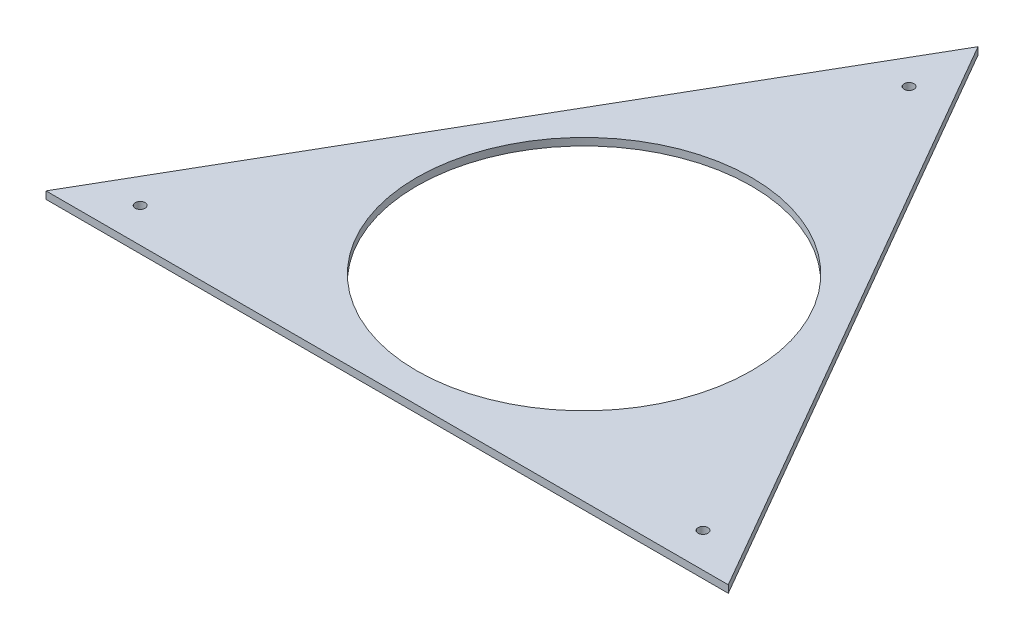
ISO-10303-21;
HEADER;
FILE_DESCRIPTION(('STEP AP214'),'2;1');
FILE_NAME('part.step','',(''),(''),'','','');
FILE_SCHEMA(('AUTOMOTIVE_DESIGN { 1 0 10303 214 1 1 1 1 }'));
ENDSEC;
DATA;
#1=APPLICATION_CONTEXT('core data for automotive mechanical design processes');
#2=APPLICATION_PROTOCOL_DEFINITION('international standard','automotive_design',2000,#1);
#3=PRODUCT_CONTEXT('',#1,'mechanical');
#4=PRODUCT('Part','Part','',(#3));
#5=PRODUCT_RELATED_PRODUCT_CATEGORY('part','',(#4));
#6=PRODUCT_DEFINITION_FORMATION('','',#4);
#7=PRODUCT_DEFINITION_CONTEXT('part definition',#1,'design');
#8=PRODUCT_DEFINITION('design','',#6,#7);
#9=PRODUCT_DEFINITION_SHAPE('','',#8);
#10=(LENGTH_UNIT() NAMED_UNIT(*) SI_UNIT(.MILLI.,.METRE.));
#11=(NAMED_UNIT(*) PLANE_ANGLE_UNIT() SI_UNIT($,.RADIAN.));
#12=(NAMED_UNIT(*) SI_UNIT($,.STERADIAN.) SOLID_ANGLE_UNIT());
#13=UNCERTAINTY_MEASURE_WITH_UNIT(LENGTH_MEASURE(1.E-05),#10,'distance_accuracy_value','');
#14=(GEOMETRIC_REPRESENTATION_CONTEXT(3) GLOBAL_UNCERTAINTY_ASSIGNED_CONTEXT((#13)) GLOBAL_UNIT_ASSIGNED_CONTEXT((#10,
#11,#12)) REPRESENTATION_CONTEXT('',''));
#15=CARTESIAN_POINT('',(0.,0.,0.));
#16=DIRECTION('',(0.,0.,1.));
#17=DIRECTION('',(1.,0.,0.));
#18=AXIS2_PLACEMENT_3D('',#15,#16,#17);
#19=CARTESIAN_POINT('',(219.970452561248,4.7625,127.));
#20=DIRECTION('',(-0.866025403784438,0.,0.500000000000001));
#21=DIRECTION('',(0.500000000000001,0.,0.866025403784438));
#22=AXIS2_PLACEMENT_3D('',#19,#20,#21);
#23=PLANE('',#22);
#24=DIRECTION('',(-0.500000000000001,0.,-0.866025403784438));
#25=VECTOR('',#24,1.);
#26=CARTESIAN_POINT('',(219.970452561248,0.,127.));
#27=LINE('',#26,#25);
#28=CARTESIAN_POINT('',(219.970452561248,0.,127.));
#29=VERTEX_POINT('',#28);
#30=CARTESIAN_POINT('',(0.,0.,-254.));
#31=VERTEX_POINT('',#30);
#32=EDGE_CURVE('E84',#29,#31,#27,.T.);
#33=ORIENTED_EDGE('',*,*,#32,.T.);
#34=DIRECTION('',(0.,-1.,0.));
#35=VECTOR('',#34,1.);
#36=CARTESIAN_POINT('',(0.,4.7625,-254.));
#37=LINE('',#36,#35);
#38=CARTESIAN_POINT('',(0.,4.7625,-254.));
#39=VERTEX_POINT('',#38);
#40=EDGE_CURVE('E11',#39,#31,#37,.T.);
#41=ORIENTED_EDGE('',*,*,#40,.F.);
#42=DIRECTION('',(-0.500000000000001,0.,-0.866025403784438));
#43=VECTOR('',#42,1.);
#44=CARTESIAN_POINT('',(219.970452561248,4.7625,127.));
#45=LINE('',#44,#43);
#46=CARTESIAN_POINT('',(219.970452561248,4.7625,127.));
#47=VERTEX_POINT('',#46);
#48=EDGE_CURVE('E77',#47,#39,#45,.T.);
#49=ORIENTED_EDGE('',*,*,#48,.F.);
#50=DIRECTION('',(0.,-1.,0.));
#51=VECTOR('',#50,1.);
#52=CARTESIAN_POINT('',(219.970452561248,4.7625,127.));
#53=LINE('',#52,#51);
#54=EDGE_CURVE('E85',#47,#29,#53,.T.);
#55=ORIENTED_EDGE('',*,*,#54,.T.);
#56=EDGE_LOOP('',(#33,#41,#49,#55));
#57=FACE_BOUND('',#56,.T.);
#58=ADVANCED_FACE('F36',(#57),#23,.F.);
#59=CARTESIAN_POINT('',(0.,4.7625,-254.));
#60=DIRECTION('',(0.866025403784439,0.,0.5));
#61=DIRECTION('',(0.5,0.,-0.866025403784439));
#62=AXIS2_PLACEMENT_3D('',#59,#60,#61);
#63=PLANE('',#62);
#64=DIRECTION('',(-0.5,0.,0.866025403784438));
#65=VECTOR('',#64,1.);
#66=CARTESIAN_POINT('',(0.,0.,-254.));
#67=LINE('',#66,#65);
#68=CARTESIAN_POINT('',(-219.970452561247,0.,127.));
#69=VERTEX_POINT('',#68);
#70=EDGE_CURVE('E65',#31,#69,#67,.T.);
#71=ORIENTED_EDGE('',*,*,#70,.T.);
#72=DIRECTION('',(0.,-1.,0.));
#73=VECTOR('',#72,1.);
#74=CARTESIAN_POINT('',(-219.970452561247,4.7625,127.));
#75=LINE('',#74,#73);
#76=CARTESIAN_POINT('',(-219.970452561247,4.7625,127.));
#77=VERTEX_POINT('',#76);
#78=EDGE_CURVE('E45',#77,#69,#75,.T.);
#79=ORIENTED_EDGE('',*,*,#78,.F.);
#80=DIRECTION('',(-0.5,0.,0.866025403784438));
#81=VECTOR('',#80,1.);
#82=CARTESIAN_POINT('',(0.,4.7625,-254.));
#83=LINE('',#82,#81);
#84=EDGE_CURVE('E73',#39,#77,#83,.T.);
#85=ORIENTED_EDGE('',*,*,#84,.F.);
#86=ORIENTED_EDGE('',*,*,#40,.T.);
#87=EDGE_LOOP('',(#71,#79,#85,#86));
#88=FACE_BOUND('',#87,.T.);
#89=ADVANCED_FACE('F74',(#88),#63,.F.);
#90=CARTESIAN_POINT('',(-219.970452561247,4.7625,127.));
#91=DIRECTION('',(0.,0.,-1.));
#92=DIRECTION('',(-1.,0.,0.));
#93=AXIS2_PLACEMENT_3D('',#90,#91,#92);
#94=PLANE('',#93);
#95=DIRECTION('',(1.,0.,0.));
#96=VECTOR('',#95,1.);
#97=CARTESIAN_POINT('',(-219.970452561247,0.,127.));
#98=LINE('',#97,#96);
#99=EDGE_CURVE('E70',#69,#29,#98,.T.);
#100=ORIENTED_EDGE('',*,*,#99,.T.);
#101=ORIENTED_EDGE('',*,*,#54,.F.);
#102=DIRECTION('',(1.,0.,0.));
#103=VECTOR('',#102,1.);
#104=CARTESIAN_POINT('',(-219.970452561247,4.7625,127.));
#105=LINE('',#104,#103);
#106=EDGE_CURVE('E53',#77,#47,#105,.T.);
#107=ORIENTED_EDGE('',*,*,#106,.F.);
#108=ORIENTED_EDGE('',*,*,#78,.T.);
#109=EDGE_LOOP('',(#100,#101,#107,#108));
#110=FACE_BOUND('',#109,.T.);
#111=ADVANCED_FACE('F95',(#110),#94,.F.);
#112=CARTESIAN_POINT('',(0.,4.7625,0.));
#113=DIRECTION('',(0.,1.,0.));
#114=DIRECTION('',(0.,0.,1.));
#115=AXIS2_PLACEMENT_3D('',#112,#113,#114);
#116=PLANE('',#115);
#117=CARTESIAN_POINT('',(181.475623363029,4.7625,104.775));
#118=DIRECTION('',(0.,-1.,0.));
#119=DIRECTION('',(0.,0.,1.));
#120=AXIS2_PLACEMENT_3D('',#117,#118,#119);
#121=CIRCLE('',#120,3.175);
#122=CARTESIAN_POINT('',(181.475623363029,4.7625,101.6));
#123=VERTEX_POINT('',#122);
#124=EDGE_CURVE('E191',#123,#123,#121,.T.);
#125=ORIENTED_EDGE('',*,*,#124,.T.);
#126=EDGE_LOOP('',(#125));
#127=FACE_BOUND('',#126,.T.);
#128=CARTESIAN_POINT('',(-181.475623363029,4.7625,104.775));
#129=DIRECTION('',(0.,1.,0.));
#130=DIRECTION('',(0.,0.,1.));
#131=AXIS2_PLACEMENT_3D('',#128,#129,#130);
#132=CIRCLE('',#131,3.175);
#133=CARTESIAN_POINT('',(-181.475623363029,4.7625,101.6));
#134=VERTEX_POINT('',#133);
#135=EDGE_CURVE('E201',#134,#134,#132,.T.);
#136=ORIENTED_EDGE('',*,*,#135,.F.);
#137=EDGE_LOOP('',(#136));
#138=FACE_BOUND('',#137,.T.);
#139=CARTESIAN_POINT('',(0.,4.7625,-209.55));
#140=DIRECTION('',(0.,1.,0.));
#141=DIRECTION('',(0.,0.,1.));
#142=AXIS2_PLACEMENT_3D('',#139,#140,#141);
#143=CIRCLE('',#142,3.175);
#144=CARTESIAN_POINT('',(0.,4.7625,-212.725));
#145=VERTEX_POINT('',#144);
#146=EDGE_CURVE('E186',#145,#145,#143,.T.);
#147=ORIENTED_EDGE('',*,*,#146,.F.);
#148=EDGE_LOOP('',(#147));
#149=FACE_BOUND('',#148,.T.);
#150=CARTESIAN_POINT('',(0.,4.7625,0.));
#151=DIRECTION('',(0.,1.,0.));
#152=DIRECTION('',(0.,0.,1.));
#153=AXIS2_PLACEMENT_3D('',#150,#151,#152);
#154=CIRCLE('',#153,107.95);
#155=CARTESIAN_POINT('',(0.,4.7625,-107.95));
#156=VERTEX_POINT('',#155);
#157=EDGE_CURVE('E90',#156,#156,#154,.T.);
#158=ORIENTED_EDGE('',*,*,#157,.F.);
#159=EDGE_LOOP('',(#158));
#160=FACE_BOUND('',#159,.T.);
#161=ORIENTED_EDGE('',*,*,#48,.T.);
#162=ORIENTED_EDGE('',*,*,#84,.T.);
#163=ORIENTED_EDGE('',*,*,#106,.T.);
#164=EDGE_LOOP('',(#161,#162,#163));
#165=FACE_BOUND('',#164,.T.);
#166=ADVANCED_FACE('F80',(#127,#138,#149,#160,#165),#116,.T.);
#167=CARTESIAN_POINT('',(0.,0.,0.));
#168=DIRECTION('',(0.,1.,0.));
#169=DIRECTION('',(0.,0.,1.));
#170=AXIS2_PLACEMENT_3D('',#167,#168,#169);
#171=PLANE('',#170);
#172=CARTESIAN_POINT('',(181.475623363029,0.,104.775));
#173=DIRECTION('',(0.,-1.,0.));
#174=DIRECTION('',(0.,0.,1.));
#175=AXIS2_PLACEMENT_3D('',#172,#173,#174);
#176=CIRCLE('',#175,3.175);
#177=CARTESIAN_POINT('',(181.475623363029,0.,101.6));
#178=VERTEX_POINT('',#177);
#179=EDGE_CURVE('E196',#178,#178,#176,.T.);
#180=ORIENTED_EDGE('',*,*,#179,.F.);
#181=EDGE_LOOP('',(#180));
#182=FACE_BOUND('',#181,.T.);
#183=CARTESIAN_POINT('',(-181.475623363029,0.,104.775));
#184=DIRECTION('',(0.,1.,0.));
#185=DIRECTION('',(0.,0.,1.));
#186=AXIS2_PLACEMENT_3D('',#183,#184,#185);
#187=CIRCLE('',#186,3.175);
#188=CARTESIAN_POINT('',(-181.475623363029,0.,101.6));
#189=VERTEX_POINT('',#188);
#190=EDGE_CURVE('E193',#189,#189,#187,.T.);
#191=ORIENTED_EDGE('',*,*,#190,.T.);
#192=EDGE_LOOP('',(#191));
#193=FACE_BOUND('',#192,.T.);
#194=CARTESIAN_POINT('',(0.,0.,-209.55));
#195=DIRECTION('',(0.,1.,0.));
#196=DIRECTION('',(0.,0.,1.));
#197=AXIS2_PLACEMENT_3D('',#194,#195,#196);
#198=CIRCLE('',#197,3.175);
#199=CARTESIAN_POINT('',(0.,0.,-212.725));
#200=VERTEX_POINT('',#199);
#201=EDGE_CURVE('E189',#200,#200,#198,.T.);
#202=ORIENTED_EDGE('',*,*,#201,.T.);
#203=EDGE_LOOP('',(#202));
#204=FACE_BOUND('',#203,.T.);
#205=CARTESIAN_POINT('',(0.,0.,0.));
#206=DIRECTION('',(0.,1.,0.));
#207=DIRECTION('',(0.,0.,1.));
#208=AXIS2_PLACEMENT_3D('',#205,#206,#207);
#209=CIRCLE('',#208,107.95);
#210=CARTESIAN_POINT('',(0.,0.,-107.95));
#211=VERTEX_POINT('',#210);
#212=EDGE_CURVE('E39',#211,#211,#209,.F.);
#213=ORIENTED_EDGE('',*,*,#212,.F.);
#214=EDGE_LOOP('',(#213));
#215=FACE_BOUND('',#214,.T.);
#216=ORIENTED_EDGE('',*,*,#32,.F.);
#217=ORIENTED_EDGE('',*,*,#99,.F.);
#218=ORIENTED_EDGE('',*,*,#70,.F.);
#219=EDGE_LOOP('',(#216,#217,#218));
#220=FACE_BOUND('',#219,.T.);
#221=ADVANCED_FACE('F96',(#182,#193,#204,#215,#220),#171,.F.);
#222=CARTESIAN_POINT('',(0.,4.7625,0.));
#223=DIRECTION('',(0.,-1.,0.));
#224=DIRECTION('',(0.,0.,-1.));
#225=AXIS2_PLACEMENT_3D('',#222,#223,#224);
#226=CYLINDRICAL_SURFACE('',#225,107.95);
#227=CARTESIAN_POINT('',(0.,4.7625,-107.95));
#228=CARTESIAN_POINT('',(0.,4.712890625,-107.95));
#229=CARTESIAN_POINT('',(0.,4.66328125,-107.95));
#230=CARTESIAN_POINT('',(0.,4.5640625,-107.95));
#231=CARTESIAN_POINT('',(0.,4.514453125,-107.95));
#232=CARTESIAN_POINT('',(0.,4.415234375,-107.95));
#233=CARTESIAN_POINT('',(0.,4.365625,-107.95));
#234=CARTESIAN_POINT('',(0.,4.26640625,-107.95));
#235=CARTESIAN_POINT('',(0.,4.216796875,-107.95));
#236=CARTESIAN_POINT('',(0.,4.117578125,-107.95));
#237=CARTESIAN_POINT('',(0.,4.06796875,-107.95));
#238=CARTESIAN_POINT('',(0.,3.96875,-107.95));
#239=CARTESIAN_POINT('',(0.,3.919140625,-107.95));
#240=CARTESIAN_POINT('',(0.,3.819921875,-107.95));
#241=CARTESIAN_POINT('',(0.,3.7703125,-107.95));
#242=CARTESIAN_POINT('',(0.,3.67109375,-107.95));
#243=CARTESIAN_POINT('',(0.,3.621484375,-107.95));
#244=CARTESIAN_POINT('',(0.,3.522265625,-107.95));
#245=CARTESIAN_POINT('',(0.,3.47265625,-107.95));
#246=CARTESIAN_POINT('',(0.,3.3734375,-107.95));
#247=CARTESIAN_POINT('',(0.,3.323828125,-107.95));
#248=CARTESIAN_POINT('',(0.,3.224609375,-107.95));
#249=CARTESIAN_POINT('',(0.,3.175,-107.95));
#250=CARTESIAN_POINT('',(0.,3.07578125,-107.95));
#251=CARTESIAN_POINT('',(0.,3.026171875,-107.95));
#252=CARTESIAN_POINT('',(0.,2.926953125,-107.95));
#253=CARTESIAN_POINT('',(0.,2.87734375,-107.95));
#254=CARTESIAN_POINT('',(0.,2.778125,-107.95));
#255=CARTESIAN_POINT('',(0.,2.728515625,-107.95));
#256=CARTESIAN_POINT('',(0.,2.629296875,-107.95));
#257=CARTESIAN_POINT('',(0.,2.5796875,-107.95));
#258=CARTESIAN_POINT('',(0.,2.48046875,-107.95));
#259=CARTESIAN_POINT('',(0.,2.430859375,-107.95));
#260=CARTESIAN_POINT('',(0.,2.331640625,-107.95));
#261=CARTESIAN_POINT('',(0.,2.28203125,-107.95));
#262=CARTESIAN_POINT('',(0.,2.1828125,-107.95));
#263=CARTESIAN_POINT('',(0.,2.133203125,-107.95));
#264=CARTESIAN_POINT('',(0.,2.033984375,-107.95));
#265=CARTESIAN_POINT('',(0.,1.984375,-107.95));
#266=CARTESIAN_POINT('',(0.,1.88515625,-107.95));
#267=CARTESIAN_POINT('',(0.,1.835546875,-107.95));
#268=CARTESIAN_POINT('',(0.,1.736328125,-107.95));
#269=CARTESIAN_POINT('',(0.,1.68671875,-107.95));
#270=CARTESIAN_POINT('',(0.,1.5875,-107.95));
#271=CARTESIAN_POINT('',(0.,1.537890625,-107.95));
#272=CARTESIAN_POINT('',(0.,1.438671875,-107.95));
#273=CARTESIAN_POINT('',(0.,1.3890625,-107.95));
#274=CARTESIAN_POINT('',(0.,1.28984375,-107.95));
#275=CARTESIAN_POINT('',(0.,1.240234375,-107.95));
#276=CARTESIAN_POINT('',(0.,1.141015625,-107.95));
#277=CARTESIAN_POINT('',(0.,1.09140625,-107.95));
#278=CARTESIAN_POINT('',(0.,0.992187499999999,-107.95));
#279=CARTESIAN_POINT('',(0.,0.942578124999999,-107.95));
#280=CARTESIAN_POINT('',(0.,0.843359375,-107.95));
#281=CARTESIAN_POINT('',(0.,0.79375,-107.95));
#282=CARTESIAN_POINT('',(0.,0.69453125,-107.95));
#283=CARTESIAN_POINT('',(0.,0.644921875,-107.95));
#284=CARTESIAN_POINT('',(0.,0.545703125,-107.95));
#285=CARTESIAN_POINT('',(0.,0.49609375,-107.95));
#286=CARTESIAN_POINT('',(0.,0.396875,-107.95));
#287=CARTESIAN_POINT('',(0.,0.347265625,-107.95));
#288=CARTESIAN_POINT('',(0.,0.248046875,-107.95));
#289=CARTESIAN_POINT('',(0.,0.1984375,-107.95));
#290=CARTESIAN_POINT('',(0.,0.09921875,-107.95));
#291=CARTESIAN_POINT('',(0.,0.049609375,-107.95));
#292=CARTESIAN_POINT('',(0.,0.,-107.95));
#293=B_SPLINE_CURVE_WITH_KNOTS('',3,(#227,#228,#229,#230,#231,#232,#233,#234,#235,#236,#237,
#238,#239,#240,#241,#242,#243,#244,#245,#246,#247,#248,#249,#250,#251,#252,#253,#254,#255,#256,
#257,#258,#259,#260,#261,#262,#263,#264,#265,#266,#267,#268,#269,#270,#271,#272,#273,#274,#275,
#276,#277,#278,#279,#280,#281,#282,#283,#284,#285,#286,#287,#288,#289,#290,#291,#292),
.UNSPECIFIED.,.F.,.F.,(4,2,2,2,2,2,2,2,2,2,2,2,2,2,2,2,2,2,2,2,2,2,2,2,2,2,2,2,2,2,2,2,4),(0.,
0.148828125,0.29765625,0.446484375,0.5953125,0.744140625,0.892968750000001,1.041796875,1.190625,
1.339453125,1.48828125,1.637109375,1.7859375,1.934765625,2.08359375,2.232421875,2.38125,
2.530078125,2.67890625,2.827734375,2.9765625,3.125390625,3.27421875,3.423046875,3.571875,
3.720703125,3.86953125,4.018359375,4.1671875,4.316015625,4.46484375,4.613671875,4.7625),.UNSPECIFIED.);
#294=EDGE_CURVE('BSEAM98',#156,#211,#293,.T.);
#295=ORIENTED_EDGE('',*,*,#157,.T.);
#296=ORIENTED_EDGE('',*,*,#212,.T.);
#297=ORIENTED_EDGE('',*,*,#294,.T.);
#298=ORIENTED_EDGE('',*,*,#294,.F.);
#299=EDGE_LOOP('',(#295,#297,#296,#298));
#300=FACE_BOUND('',#299,.T.);
#301=ADVANCED_FACE('F98',(#300),#226,.F.);
#302=CARTESIAN_POINT('',(0.,4.7625,-209.55));
#303=DIRECTION('',(0.,-1.,0.));
#304=DIRECTION('',(0.,0.,-1.));
#305=AXIS2_PLACEMENT_3D('',#302,#303,#304);
#306=CYLINDRICAL_SURFACE('',#305,3.175);
#307=CARTESIAN_POINT('',(0.,4.7625,-212.725));
#308=CARTESIAN_POINT('',(0.,4.712890625,-212.725));
#309=CARTESIAN_POINT('',(0.,4.66328125,-212.725));
#310=CARTESIAN_POINT('',(0.,4.5640625,-212.725));
#311=CARTESIAN_POINT('',(0.,4.514453125,-212.725));
#312=CARTESIAN_POINT('',(0.,4.415234375,-212.725));
#313=CARTESIAN_POINT('',(0.,4.365625,-212.725));
#314=CARTESIAN_POINT('',(0.,4.26640625,-212.725));
#315=CARTESIAN_POINT('',(0.,4.216796875,-212.725));
#316=CARTESIAN_POINT('',(0.,4.117578125,-212.725));
#317=CARTESIAN_POINT('',(0.,4.06796875,-212.725));
#318=CARTESIAN_POINT('',(0.,3.96875,-212.725));
#319=CARTESIAN_POINT('',(0.,3.919140625,-212.725));
#320=CARTESIAN_POINT('',(0.,3.819921875,-212.725));
#321=CARTESIAN_POINT('',(0.,3.7703125,-212.725));
#322=CARTESIAN_POINT('',(0.,3.67109375,-212.725));
#323=CARTESIAN_POINT('',(0.,3.621484375,-212.725));
#324=CARTESIAN_POINT('',(0.,3.522265625,-212.725));
#325=CARTESIAN_POINT('',(0.,3.47265625,-212.725));
#326=CARTESIAN_POINT('',(0.,3.3734375,-212.725));
#327=CARTESIAN_POINT('',(0.,3.323828125,-212.725));
#328=CARTESIAN_POINT('',(0.,3.224609375,-212.725));
#329=CARTESIAN_POINT('',(0.,3.175,-212.725));
#330=CARTESIAN_POINT('',(0.,3.07578125,-212.725));
#331=CARTESIAN_POINT('',(0.,3.026171875,-212.725));
#332=CARTESIAN_POINT('',(0.,2.926953125,-212.725));
#333=CARTESIAN_POINT('',(0.,2.87734375,-212.725));
#334=CARTESIAN_POINT('',(0.,2.778125,-212.725));
#335=CARTESIAN_POINT('',(0.,2.728515625,-212.725));
#336=CARTESIAN_POINT('',(0.,2.629296875,-212.725));
#337=CARTESIAN_POINT('',(0.,2.5796875,-212.725));
#338=CARTESIAN_POINT('',(0.,2.48046875,-212.725));
#339=CARTESIAN_POINT('',(0.,2.430859375,-212.725));
#340=CARTESIAN_POINT('',(0.,2.331640625,-212.725));
#341=CARTESIAN_POINT('',(0.,2.28203125,-212.725));
#342=CARTESIAN_POINT('',(0.,2.1828125,-212.725));
#343=CARTESIAN_POINT('',(0.,2.133203125,-212.725));
#344=CARTESIAN_POINT('',(0.,2.033984375,-212.725));
#345=CARTESIAN_POINT('',(0.,1.984375,-212.725));
#346=CARTESIAN_POINT('',(0.,1.88515625,-212.725));
#347=CARTESIAN_POINT('',(0.,1.835546875,-212.725));
#348=CARTESIAN_POINT('',(0.,1.736328125,-212.725));
#349=CARTESIAN_POINT('',(0.,1.68671875,-212.725));
#350=CARTESIAN_POINT('',(0.,1.5875,-212.725));
#351=CARTESIAN_POINT('',(0.,1.537890625,-212.725));
#352=CARTESIAN_POINT('',(0.,1.438671875,-212.725));
#353=CARTESIAN_POINT('',(0.,1.3890625,-212.725));
#354=CARTESIAN_POINT('',(0.,1.28984375,-212.725));
#355=CARTESIAN_POINT('',(0.,1.240234375,-212.725));
#356=CARTESIAN_POINT('',(0.,1.141015625,-212.725));
#357=CARTESIAN_POINT('',(0.,1.09140625,-212.725));
#358=CARTESIAN_POINT('',(0.,0.9921875,-212.725));
#359=CARTESIAN_POINT('',(0.,0.942578125,-212.725));
#360=CARTESIAN_POINT('',(0.,0.843359375,-212.725));
#361=CARTESIAN_POINT('',(0.,0.79375,-212.725));
#362=CARTESIAN_POINT('',(0.,0.69453125,-212.725));
#363=CARTESIAN_POINT('',(0.,0.644921875,-212.725));
#364=CARTESIAN_POINT('',(0.,0.545703125,-212.725));
#365=CARTESIAN_POINT('',(0.,0.49609375,-212.725));
#366=CARTESIAN_POINT('',(0.,0.396875,-212.725));
#367=CARTESIAN_POINT('',(0.,0.347265625,-212.725));
#368=CARTESIAN_POINT('',(0.,0.248046875,-212.725));
#369=CARTESIAN_POINT('',(0.,0.1984375,-212.725));
#370=CARTESIAN_POINT('',(0.,0.09921875,-212.725));
#371=CARTESIAN_POINT('',(0.,0.049609375,-212.725));
#372=CARTESIAN_POINT('',(0.,0.,-212.725));
#373=B_SPLINE_CURVE_WITH_KNOTS('',3,(#307,#308,#309,#310,#311,#312,#313,#314,#315,#316,#317,
#318,#319,#320,#321,#322,#323,#324,#325,#326,#327,#328,#329,#330,#331,#332,#333,#334,#335,#336,
#337,#338,#339,#340,#341,#342,#343,#344,#345,#346,#347,#348,#349,#350,#351,#352,#353,#354,#355,
#356,#357,#358,#359,#360,#361,#362,#363,#364,#365,#366,#367,#368,#369,#370,#371,#372),
.UNSPECIFIED.,.F.,.F.,(4,2,2,2,2,2,2,2,2,2,2,2,2,2,2,2,2,2,2,2,2,2,2,2,2,2,2,2,2,2,2,2,4),(0.,
0.148828124999999,0.297656249999999,0.446484374999999,0.595312499999999,0.744140625,0.89296875,
1.041796875,1.190625,1.339453125,1.48828125,1.637109375,1.7859375,1.934765625,2.08359375,
2.232421875,2.38125,2.530078125,2.67890625,2.827734375,2.9765625,3.125390625,3.27421875,
3.423046875,3.571875,3.720703125,3.86953125,4.018359375,4.1671875,4.316015625,4.46484375,
4.613671875,4.7625),.UNSPECIFIED.);
#374=EDGE_CURVE('BSEAM105',#145,#200,#373,.T.);
#375=ORIENTED_EDGE('',*,*,#146,.T.);
#376=ORIENTED_EDGE('',*,*,#201,.F.);
#377=ORIENTED_EDGE('',*,*,#374,.T.);
#378=ORIENTED_EDGE('',*,*,#374,.F.);
#379=EDGE_LOOP('',(#375,#377,#376,#378));
#380=FACE_BOUND('',#379,.T.);
#381=ADVANCED_FACE('F105',(#380),#306,.F.);
#382=CARTESIAN_POINT('',(-181.475623363029,4.7625,104.775));
#383=DIRECTION('',(0.,-1.,0.));
#384=DIRECTION('',(0.,0.,-1.));
#385=AXIS2_PLACEMENT_3D('',#382,#383,#384);
#386=CYLINDRICAL_SURFACE('',#385,3.175);
#387=CARTESIAN_POINT('',(-181.475623363029,4.7625,101.6));
#388=CARTESIAN_POINT('',(-181.475623363029,4.712890625,101.6));
#389=CARTESIAN_POINT('',(-181.475623363029,4.66328125,101.6));
#390=CARTESIAN_POINT('',(-181.475623363029,4.5640625,101.6));
#391=CARTESIAN_POINT('',(-181.475623363029,4.514453125,101.6));
#392=CARTESIAN_POINT('',(-181.475623363029,4.415234375,101.6));
#393=CARTESIAN_POINT('',(-181.475623363029,4.365625,101.6));
#394=CARTESIAN_POINT('',(-181.475623363029,4.26640625,101.6));
#395=CARTESIAN_POINT('',(-181.475623363029,4.216796875,101.6));
#396=CARTESIAN_POINT('',(-181.475623363029,4.117578125,101.6));
#397=CARTESIAN_POINT('',(-181.475623363029,4.06796875,101.6));
#398=CARTESIAN_POINT('',(-181.475623363029,3.96875,101.6));
#399=CARTESIAN_POINT('',(-181.475623363029,3.919140625,101.6));
#400=CARTESIAN_POINT('',(-181.475623363029,3.819921875,101.6));
#401=CARTESIAN_POINT('',(-181.475623363029,3.7703125,101.6));
#402=CARTESIAN_POINT('',(-181.475623363029,3.67109375,101.6));
#403=CARTESIAN_POINT('',(-181.475623363029,3.621484375,101.6));
#404=CARTESIAN_POINT('',(-181.475623363029,3.522265625,101.6));
#405=CARTESIAN_POINT('',(-181.475623363029,3.47265625,101.6));
#406=CARTESIAN_POINT('',(-181.475623363029,3.3734375,101.6));
#407=CARTESIAN_POINT('',(-181.475623363029,3.323828125,101.6));
#408=CARTESIAN_POINT('',(-181.475623363029,3.224609375,101.6));
#409=CARTESIAN_POINT('',(-181.475623363029,3.175,101.6));
#410=CARTESIAN_POINT('',(-181.475623363029,3.07578125,101.6));
#411=CARTESIAN_POINT('',(-181.475623363029,3.026171875,101.6));
#412=CARTESIAN_POINT('',(-181.475623363029,2.926953125,101.6));
#413=CARTESIAN_POINT('',(-181.475623363029,2.87734375,101.6));
#414=CARTESIAN_POINT('',(-181.475623363029,2.778125,101.6));
#415=CARTESIAN_POINT('',(-181.475623363029,2.728515625,101.6));
#416=CARTESIAN_POINT('',(-181.475623363029,2.629296875,101.6));
#417=CARTESIAN_POINT('',(-181.475623363029,2.5796875,101.6));
#418=CARTESIAN_POINT('',(-181.475623363029,2.48046875,101.6));
#419=CARTESIAN_POINT('',(-181.475623363029,2.430859375,101.6));
#420=CARTESIAN_POINT('',(-181.475623363029,2.331640625,101.6));
#421=CARTESIAN_POINT('',(-181.475623363029,2.28203125,101.6));
#422=CARTESIAN_POINT('',(-181.475623363029,2.1828125,101.6));
#423=CARTESIAN_POINT('',(-181.475623363029,2.133203125,101.6));
#424=CARTESIAN_POINT('',(-181.475623363029,2.033984375,101.6));
#425=CARTESIAN_POINT('',(-181.475623363029,1.984375,101.6));
#426=CARTESIAN_POINT('',(-181.475623363029,1.88515625,101.6));
#427=CARTESIAN_POINT('',(-181.475623363029,1.835546875,101.6));
#428=CARTESIAN_POINT('',(-181.475623363029,1.736328125,101.6));
#429=CARTESIAN_POINT('',(-181.475623363029,1.68671875,101.6));
#430=CARTESIAN_POINT('',(-181.475623363029,1.5875,101.6));
#431=CARTESIAN_POINT('',(-181.475623363029,1.537890625,101.6));
#432=CARTESIAN_POINT('',(-181.475623363029,1.438671875,101.6));
#433=CARTESIAN_POINT('',(-181.475623363029,1.3890625,101.6));
#434=CARTESIAN_POINT('',(-181.475623363029,1.28984375,101.6));
#435=CARTESIAN_POINT('',(-181.475623363029,1.240234375,101.6));
#436=CARTESIAN_POINT('',(-181.475623363029,1.141015625,101.6));
#437=CARTESIAN_POINT('',(-181.475623363029,1.09140625,101.6));
#438=CARTESIAN_POINT('',(-181.475623363029,0.9921875,101.6));
#439=CARTESIAN_POINT('',(-181.475623363029,0.942578125,101.6));
#440=CARTESIAN_POINT('',(-181.475623363029,0.843359375,101.6));
#441=CARTESIAN_POINT('',(-181.475623363029,0.79375,101.6));
#442=CARTESIAN_POINT('',(-181.475623363029,0.69453125,101.6));
#443=CARTESIAN_POINT('',(-181.475623363029,0.644921875,101.6));
#444=CARTESIAN_POINT('',(-181.475623363029,0.545703125,101.6));
#445=CARTESIAN_POINT('',(-181.475623363029,0.49609375,101.6));
#446=CARTESIAN_POINT('',(-181.475623363029,0.396875,101.6));
#447=CARTESIAN_POINT('',(-181.475623363029,0.347265625,101.6));
#448=CARTESIAN_POINT('',(-181.475623363029,0.248046875,101.6));
#449=CARTESIAN_POINT('',(-181.475623363029,0.1984375,101.6));
#450=CARTESIAN_POINT('',(-181.475623363029,0.09921875,101.6));
#451=CARTESIAN_POINT('',(-181.475623363029,0.049609375,101.6));
#452=CARTESIAN_POINT('',(-181.475623363029,0.,101.6));
#453=B_SPLINE_CURVE_WITH_KNOTS('',3,(#387,#388,#389,#390,#391,#392,#393,#394,#395,#396,#397,
#398,#399,#400,#401,#402,#403,#404,#405,#406,#407,#408,#409,#410,#411,#412,#413,#414,#415,#416,
#417,#418,#419,#420,#421,#422,#423,#424,#425,#426,#427,#428,#429,#430,#431,#432,#433,#434,#435,
#436,#437,#438,#439,#440,#441,#442,#443,#444,#445,#446,#447,#448,#449,#450,#451,#452),
.UNSPECIFIED.,.F.,.F.,(4,2,2,2,2,2,2,2,2,2,2,2,2,2,2,2,2,2,2,2,2,2,2,2,2,2,2,2,2,2,2,2,4),(0.,
0.148828124999999,0.297656249999999,0.446484374999999,0.595312499999999,0.744140625,0.89296875,
1.041796875,1.190625,1.339453125,1.48828125,1.637109375,1.7859375,1.934765625,2.08359375,
2.232421875,2.38125,2.530078125,2.67890625,2.827734375,2.9765625,3.125390625,3.27421875,
3.423046875,3.571875,3.720703125,3.86953125,4.018359375,4.1671875,4.316015625,4.46484375,
4.613671875,4.7625),.UNSPECIFIED.);
#454=EDGE_CURVE('BSEAM147',#134,#189,#453,.T.);
#455=ORIENTED_EDGE('',*,*,#135,.T.);
#456=ORIENTED_EDGE('',*,*,#190,.F.);
#457=ORIENTED_EDGE('',*,*,#454,.T.);
#458=ORIENTED_EDGE('',*,*,#454,.F.);
#459=EDGE_LOOP('',(#455,#457,#456,#458));
#460=FACE_BOUND('',#459,.T.);
#461=ADVANCED_FACE('F147',(#460),#386,.F.);
#462=CARTESIAN_POINT('',(181.475623363029,4.7625,104.775));
#463=DIRECTION('',(0.,-1.,0.));
#464=DIRECTION('',(0.,0.,-1.));
#465=AXIS2_PLACEMENT_3D('',#462,#463,#464);
#466=CYLINDRICAL_SURFACE('',#465,3.175);
#467=CARTESIAN_POINT('',(181.475623363029,4.7625,101.6));
#468=CARTESIAN_POINT('',(181.475623363029,4.712890625,101.6));
#469=CARTESIAN_POINT('',(181.475623363029,4.66328125,101.6));
#470=CARTESIAN_POINT('',(181.475623363029,4.5640625,101.6));
#471=CARTESIAN_POINT('',(181.475623363029,4.514453125,101.6));
#472=CARTESIAN_POINT('',(181.475623363029,4.415234375,101.6));
#473=CARTESIAN_POINT('',(181.475623363029,4.365625,101.6));
#474=CARTESIAN_POINT('',(181.475623363029,4.26640625,101.6));
#475=CARTESIAN_POINT('',(181.475623363029,4.216796875,101.6));
#476=CARTESIAN_POINT('',(181.475623363029,4.117578125,101.6));
#477=CARTESIAN_POINT('',(181.475623363029,4.06796875,101.6));
#478=CARTESIAN_POINT('',(181.475623363029,3.96875,101.6));
#479=CARTESIAN_POINT('',(181.475623363029,3.919140625,101.6));
#480=CARTESIAN_POINT('',(181.475623363029,3.819921875,101.6));
#481=CARTESIAN_POINT('',(181.475623363029,3.7703125,101.6));
#482=CARTESIAN_POINT('',(181.475623363029,3.67109375,101.6));
#483=CARTESIAN_POINT('',(181.475623363029,3.621484375,101.6));
#484=CARTESIAN_POINT('',(181.475623363029,3.522265625,101.6));
#485=CARTESIAN_POINT('',(181.475623363029,3.47265625,101.6));
#486=CARTESIAN_POINT('',(181.475623363029,3.3734375,101.6));
#487=CARTESIAN_POINT('',(181.475623363029,3.323828125,101.6));
#488=CARTESIAN_POINT('',(181.475623363029,3.224609375,101.6));
#489=CARTESIAN_POINT('',(181.475623363029,3.175,101.6));
#490=CARTESIAN_POINT('',(181.475623363029,3.07578125,101.6));
#491=CARTESIAN_POINT('',(181.475623363029,3.026171875,101.6));
#492=CARTESIAN_POINT('',(181.475623363029,2.926953125,101.6));
#493=CARTESIAN_POINT('',(181.475623363029,2.87734375,101.6));
#494=CARTESIAN_POINT('',(181.475623363029,2.778125,101.6));
#495=CARTESIAN_POINT('',(181.475623363029,2.728515625,101.6));
#496=CARTESIAN_POINT('',(181.475623363029,2.629296875,101.6));
#497=CARTESIAN_POINT('',(181.475623363029,2.5796875,101.6));
#498=CARTESIAN_POINT('',(181.475623363029,2.48046875,101.6));
#499=CARTESIAN_POINT('',(181.475623363029,2.430859375,101.6));
#500=CARTESIAN_POINT('',(181.475623363029,2.331640625,101.6));
#501=CARTESIAN_POINT('',(181.475623363029,2.28203125,101.6));
#502=CARTESIAN_POINT('',(181.475623363029,2.1828125,101.6));
#503=CARTESIAN_POINT('',(181.475623363029,2.133203125,101.6));
#504=CARTESIAN_POINT('',(181.475623363029,2.033984375,101.6));
#505=CARTESIAN_POINT('',(181.475623363029,1.984375,101.6));
#506=CARTESIAN_POINT('',(181.475623363029,1.88515625,101.6));
#507=CARTESIAN_POINT('',(181.475623363029,1.835546875,101.6));
#508=CARTESIAN_POINT('',(181.475623363029,1.736328125,101.6));
#509=CARTESIAN_POINT('',(181.475623363029,1.68671875,101.6));
#510=CARTESIAN_POINT('',(181.475623363029,1.5875,101.6));
#511=CARTESIAN_POINT('',(181.475623363029,1.537890625,101.6));
#512=CARTESIAN_POINT('',(181.475623363029,1.438671875,101.6));
#513=CARTESIAN_POINT('',(181.475623363029,1.3890625,101.6));
#514=CARTESIAN_POINT('',(181.475623363029,1.28984375,101.6));
#515=CARTESIAN_POINT('',(181.475623363029,1.240234375,101.6));
#516=CARTESIAN_POINT('',(181.475623363029,1.141015625,101.6));
#517=CARTESIAN_POINT('',(181.475623363029,1.09140625,101.6));
#518=CARTESIAN_POINT('',(181.475623363029,0.9921875,101.6));
#519=CARTESIAN_POINT('',(181.475623363029,0.942578125,101.6));
#520=CARTESIAN_POINT('',(181.475623363029,0.843359375,101.6));
#521=CARTESIAN_POINT('',(181.475623363029,0.79375,101.6));
#522=CARTESIAN_POINT('',(181.475623363029,0.69453125,101.6));
#523=CARTESIAN_POINT('',(181.475623363029,0.644921875,101.6));
#524=CARTESIAN_POINT('',(181.475623363029,0.545703125,101.6));
#525=CARTESIAN_POINT('',(181.475623363029,0.49609375,101.6));
#526=CARTESIAN_POINT('',(181.475623363029,0.396875,101.6));
#527=CARTESIAN_POINT('',(181.475623363029,0.347265625,101.6));
#528=CARTESIAN_POINT('',(181.475623363029,0.248046875,101.6));
#529=CARTESIAN_POINT('',(181.475623363029,0.1984375,101.6));
#530=CARTESIAN_POINT('',(181.475623363029,0.09921875,101.6));
#531=CARTESIAN_POINT('',(181.475623363029,0.049609375,101.6));
#532=CARTESIAN_POINT('',(181.475623363029,0.,101.6));
#533=B_SPLINE_CURVE_WITH_KNOTS('',3,(#467,#468,#469,#470,#471,#472,#473,#474,#475,#476,#477,
#478,#479,#480,#481,#482,#483,#484,#485,#486,#487,#488,#489,#490,#491,#492,#493,#494,#495,#496,
#497,#498,#499,#500,#501,#502,#503,#504,#505,#506,#507,#508,#509,#510,#511,#512,#513,#514,#515,
#516,#517,#518,#519,#520,#521,#522,#523,#524,#525,#526,#527,#528,#529,#530,#531,#532),
.UNSPECIFIED.,.F.,.F.,(4,2,2,2,2,2,2,2,2,2,2,2,2,2,2,2,2,2,2,2,2,2,2,2,2,2,2,2,2,2,2,2,4),(0.,
0.148828125,0.29765625,0.446484375,0.5953125,0.744140625,0.892968750000001,1.041796875,1.190625,
1.339453125,1.48828125,1.637109375,1.7859375,1.934765625,2.08359375,2.232421875,2.38125,
2.530078125,2.67890625,2.827734375,2.9765625,3.125390625,3.27421875,3.423046875,3.571875,
3.720703125,3.86953125,4.018359375,4.1671875,4.316015625,4.46484375,4.613671875,4.7625),.UNSPECIFIED.);
#534=EDGE_CURVE('BSEAM157',#123,#178,#533,.T.);
#535=ORIENTED_EDGE('',*,*,#124,.F.);
#536=ORIENTED_EDGE('',*,*,#179,.T.);
#537=ORIENTED_EDGE('',*,*,#534,.T.);
#538=ORIENTED_EDGE('',*,*,#534,.F.);
#539=EDGE_LOOP('',(#535,#537,#536,#538));
#540=FACE_BOUND('',#539,.T.);
#541=ADVANCED_FACE('F157',(#540),#466,.F.);
#542=CLOSED_SHELL('',(#58,#89,#111,#166,#221,#301,#381,#461,#541));
#543=MANIFOLD_SOLID_BREP('B2',#542);
#544=ADVANCED_BREP_SHAPE_REPRESENTATION('',(#18,#543),#14);
#545=SHAPE_DEFINITION_REPRESENTATION(#9,#544);
ENDSEC;
END-ISO-10303-21;
